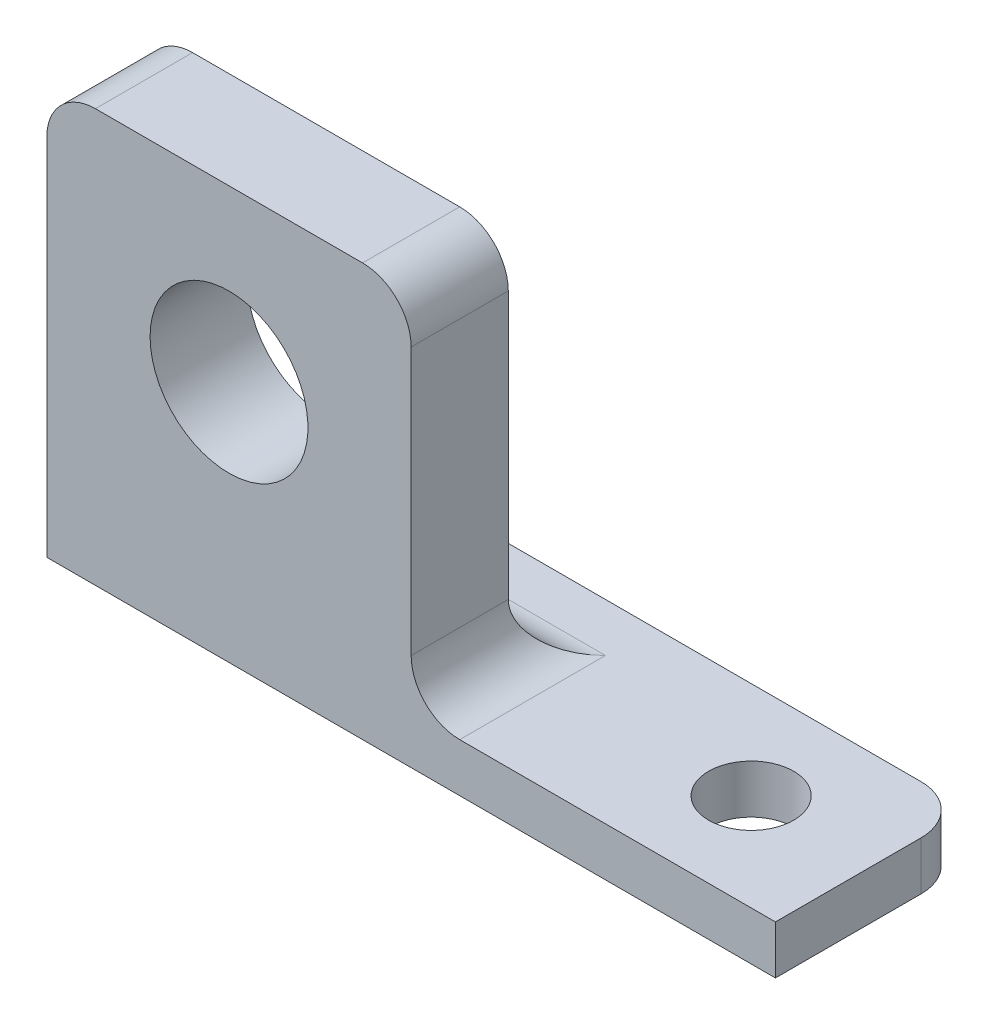
ISO-10303-21;
HEADER;
FILE_DESCRIPTION(('STEP AP214'),'2;1');
FILE_NAME('part.step','',(''),(''),'','','');
FILE_SCHEMA(('AUTOMOTIVE_DESIGN { 1 0 10303 214 1 1 1 1 }'));
ENDSEC;
DATA;
#1=APPLICATION_CONTEXT('core data for automotive mechanical design processes');
#2=APPLICATION_PROTOCOL_DEFINITION('international standard','automotive_design',2000,#1);
#3=PRODUCT_CONTEXT('',#1,'mechanical');
#4=PRODUCT('Part','Part','',(#3));
#5=PRODUCT_RELATED_PRODUCT_CATEGORY('part','',(#4));
#6=PRODUCT_DEFINITION_FORMATION('','',#4);
#7=PRODUCT_DEFINITION_CONTEXT('part definition',#1,'design');
#8=PRODUCT_DEFINITION('design','',#6,#7);
#9=PRODUCT_DEFINITION_SHAPE('','',#8);
#10=(LENGTH_UNIT() NAMED_UNIT(*) SI_UNIT(.MILLI.,.METRE.));
#11=(NAMED_UNIT(*) PLANE_ANGLE_UNIT() SI_UNIT($,.RADIAN.));
#12=(NAMED_UNIT(*) SI_UNIT($,.STERADIAN.) SOLID_ANGLE_UNIT());
#13=UNCERTAINTY_MEASURE_WITH_UNIT(LENGTH_MEASURE(1.E-05),#10,'distance_accuracy_value','');
#14=(GEOMETRIC_REPRESENTATION_CONTEXT(3) GLOBAL_UNCERTAINTY_ASSIGNED_CONTEXT((#13)) GLOBAL_UNIT_ASSIGNED_CONTEXT((#10,
#11,#12)) REPRESENTATION_CONTEXT('',''));
#15=CARTESIAN_POINT('',(0.,0.,0.));
#16=DIRECTION('',(0.,0.,1.));
#17=DIRECTION('',(1.,0.,0.));
#18=AXIS2_PLACEMENT_3D('',#15,#16,#17);
#19=CARTESIAN_POINT('',(0.,2.,0.));
#20=DIRECTION('',(0.,1.,0.));
#21=DIRECTION('',(0.,0.,1.));
#22=AXIS2_PLACEMENT_3D('',#19,#20,#21);
#23=PLANE('',#22);
#24=DIRECTION('',(0.,0.,-1.));
#25=VECTOR('',#24,1.);
#26=CARTESIAN_POINT('',(0.,2.,0.));
#27=LINE('',#26,#25);
#28=CARTESIAN_POINT('',(0.,2.,0.));
#29=VERTEX_POINT('',#28);
#30=CARTESIAN_POINT('',(0.,2.,-6.));
#31=VERTEX_POINT('',#30);
#32=EDGE_CURVE('E127',#29,#31,#27,.T.);
#33=ORIENTED_EDGE('',*,*,#32,.T.);
#34=CARTESIAN_POINT('',(-2.,2.,-6.));
#35=DIRECTION('',(0.,1.,0.));
#36=DIRECTION('',(0.,0.,1.));
#37=AXIS2_PLACEMENT_3D('',#34,#35,#36);
#38=CIRCLE('',#37,2.);
#39=CARTESIAN_POINT('',(-2.,2.,-8.));
#40=VERTEX_POINT('',#39);
#41=EDGE_CURVE('E183',#31,#40,#38,.T.);
#42=ORIENTED_EDGE('',*,*,#41,.T.);
#43=DIRECTION('',(-1.,0.,0.));
#44=VECTOR('',#43,1.);
#45=CARTESIAN_POINT('',(0.,2.,-8.));
#46=LINE('',#45,#44);
#47=CARTESIAN_POINT('',(-28.,2.,-7.99999999999999));
#48=VERTEX_POINT('',#47);
#49=EDGE_CURVE('E134',#40,#48,#46,.T.);
#50=ORIENTED_EDGE('',*,*,#49,.T.);
#51=CARTESIAN_POINT('',(-28.,2.,-5.99999999999999));
#52=DIRECTION('',(0.,1.,0.));
#53=DIRECTION('',(0.,0.,1.));
#54=AXIS2_PLACEMENT_3D('',#51,#52,#53);
#55=CIRCLE('',#54,2.);
#56=CARTESIAN_POINT('',(-30.,2.,-6.));
#57=VERTEX_POINT('',#56);
#58=EDGE_CURVE('E180',#48,#57,#55,.T.);
#59=ORIENTED_EDGE('',*,*,#58,.T.);
#60=DIRECTION('',(-1.,0.,0.));
#61=VECTOR('',#60,1.);
#62=CARTESIAN_POINT('',(0.,2.,-6.));
#63=LINE('',#62,#61);
#64=CARTESIAN_POINT('',(-13.,2.,-6.));
#65=VERTEX_POINT('',#64);
#66=EDGE_CURVE('E178',#57,#65,#63,.F.);
#67=ORIENTED_EDGE('',*,*,#66,.T.);
#68=DIRECTION('',(0.,0.,-1.));
#69=VECTOR('',#68,1.);
#70=CARTESIAN_POINT('',(-13.,2.,0.));
#71=LINE('',#70,#69);
#72=CARTESIAN_POINT('',(-13.,2.,0.));
#73=VERTEX_POINT('',#72);
#74=EDGE_CURVE('E130',#65,#73,#71,.F.);
#75=ORIENTED_EDGE('',*,*,#74,.T.);
#76=DIRECTION('',(1.,0.,0.));
#77=VECTOR('',#76,1.);
#78=CARTESIAN_POINT('',(0.,2.,0.));
#79=LINE('',#78,#77);
#80=EDGE_CURVE('E123',#73,#29,#79,.T.);
#81=ORIENTED_EDGE('',*,*,#80,.T.);
#82=EDGE_LOOP('',(#33,#42,#50,#59,#67,#75,#81));
#83=FACE_BOUND('',#82,.T.);
#84=CARTESIAN_POINT('',(-5.,2.,-4.));
#85=DIRECTION('',(0.,1.,0.));
#86=DIRECTION('',(0.,0.,1.));
#87=AXIS2_PLACEMENT_3D('',#84,#85,#86);
#88=CIRCLE('',#87,1.75);
#89=CARTESIAN_POINT('',(-5.,2.,-2.25));
#90=VERTEX_POINT('',#89);
#91=EDGE_CURVE('E161',#90,#90,#88,.T.);
#92=ORIENTED_EDGE('',*,*,#91,.F.);
#93=EDGE_LOOP('',(#92));
#94=FACE_BOUND('',#93,.T.);
#95=ADVANCED_FACE('F33',(#83,#94),#23,.T.);
#96=CARTESIAN_POINT('',(0.,0.,0.));
#97=DIRECTION('',(0.,1.,0.));
#98=DIRECTION('',(0.,0.,1.));
#99=AXIS2_PLACEMENT_3D('',#96,#97,#98);
#100=PLANE('',#99);
#101=DIRECTION('',(-1.,0.,0.));
#102=VECTOR('',#101,1.);
#103=CARTESIAN_POINT('',(0.,0.,-8.));
#104=LINE('',#103,#102);
#105=CARTESIAN_POINT('',(-2.,0.,-8.));
#106=VERTEX_POINT('',#105);
#107=CARTESIAN_POINT('',(-28.,0.,-7.99999999999999));
#108=VERTEX_POINT('',#107);
#109=EDGE_CURVE('E160',#106,#108,#104,.T.);
#110=ORIENTED_EDGE('',*,*,#109,.F.);
#111=CARTESIAN_POINT('',(-2.,0.,-6.));
#112=DIRECTION('',(0.,1.,0.));
#113=DIRECTION('',(0.,0.,1.));
#114=AXIS2_PLACEMENT_3D('',#111,#112,#113);
#115=CIRCLE('',#114,2.);
#116=CARTESIAN_POINT('',(0.,0.,-6.));
#117=VERTEX_POINT('',#116);
#118=EDGE_CURVE('E174',#106,#117,#115,.F.);
#119=ORIENTED_EDGE('',*,*,#118,.T.);
#120=DIRECTION('',(0.,0.,-1.));
#121=VECTOR('',#120,1.);
#122=CARTESIAN_POINT('',(0.,0.,0.));
#123=LINE('',#122,#121);
#124=CARTESIAN_POINT('',(0.,0.,0.));
#125=VERTEX_POINT('',#124);
#126=EDGE_CURVE('E158',#125,#117,#123,.T.);
#127=ORIENTED_EDGE('',*,*,#126,.F.);
#128=DIRECTION('',(1.,0.,0.));
#129=VECTOR('',#128,1.);
#130=CARTESIAN_POINT('',(0.,0.,0.));
#131=LINE('',#130,#129);
#132=CARTESIAN_POINT('',(-30.,0.,0.));
#133=VERTEX_POINT('',#132);
#134=EDGE_CURVE('E140',#133,#125,#131,.T.);
#135=ORIENTED_EDGE('',*,*,#134,.F.);
#136=DIRECTION('',(0.,0.,1.));
#137=VECTOR('',#136,1.);
#138=CARTESIAN_POINT('',(-30.,0.,0.));
#139=LINE('',#138,#137);
#140=CARTESIAN_POINT('',(-30.,0.,-5.99999999999999));
#141=VERTEX_POINT('',#140);
#142=EDGE_CURVE('E152',#141,#133,#139,.T.);
#143=ORIENTED_EDGE('',*,*,#142,.F.);
#144=CARTESIAN_POINT('',(-28.,0.,-5.99999999999999));
#145=DIRECTION('',(0.,1.,0.));
#146=DIRECTION('',(0.,0.,1.));
#147=AXIS2_PLACEMENT_3D('',#144,#145,#146);
#148=CIRCLE('',#147,2.);
#149=EDGE_CURVE('E172',#141,#108,#148,.F.);
#150=ORIENTED_EDGE('',*,*,#149,.T.);
#151=EDGE_LOOP('',(#110,#119,#127,#135,#143,#150));
#152=FACE_BOUND('',#151,.T.);
#153=CARTESIAN_POINT('',(-5.,0.,-4.));
#154=DIRECTION('',(0.,1.,0.));
#155=DIRECTION('',(0.,0.,1.));
#156=AXIS2_PLACEMENT_3D('',#153,#154,#155);
#157=CIRCLE('',#156,1.75);
#158=CARTESIAN_POINT('',(-5.,0.,-2.25));
#159=VERTEX_POINT('',#158);
#160=EDGE_CURVE('E155',#159,#159,#157,.T.);
#161=ORIENTED_EDGE('',*,*,#160,.T.);
#162=EDGE_LOOP('',(#161));
#163=FACE_BOUND('',#162,.T.);
#164=ADVANCED_FACE('F253',(#152,#163),#100,.F.);
#165=CARTESIAN_POINT('',(0.,2.,0.));
#166=DIRECTION('',(-1.,0.,0.));
#167=DIRECTION('',(0.,0.,1.));
#168=AXIS2_PLACEMENT_3D('',#165,#166,#167);
#169=PLANE('',#168);
#170=ORIENTED_EDGE('',*,*,#126,.T.);
#171=DIRECTION('',(0.,-1.,0.));
#172=VECTOR('',#171,1.);
#173=CARTESIAN_POINT('',(0.,2.,-6.));
#174=LINE('',#173,#172);
#175=EDGE_CURVE('E148',#117,#31,#174,.F.);
#176=ORIENTED_EDGE('',*,*,#175,.T.);
#177=ORIENTED_EDGE('',*,*,#32,.F.);
#178=DIRECTION('',(0.,-1.,0.));
#179=VECTOR('',#178,1.);
#180=CARTESIAN_POINT('',(0.,2.,0.));
#181=LINE('',#180,#179);
#182=EDGE_CURVE('E133',#29,#125,#181,.T.);
#183=ORIENTED_EDGE('',*,*,#182,.T.);
#184=EDGE_LOOP('',(#170,#176,#177,#183));
#185=FACE_BOUND('',#184,.T.);
#186=ADVANCED_FACE('F146',(#185),#169,.F.);
#187=CARTESIAN_POINT('',(0.,2.,-8.));
#188=DIRECTION('',(0.,0.,1.));
#189=DIRECTION('',(1.,0.,0.));
#190=AXIS2_PLACEMENT_3D('',#187,#188,#189);
#191=PLANE('',#190);
#192=ORIENTED_EDGE('',*,*,#49,.F.);
#193=DIRECTION('',(0.,-1.,0.));
#194=VECTOR('',#193,1.);
#195=CARTESIAN_POINT('',(-2.,2.,-8.));
#196=LINE('',#195,#194);
#197=EDGE_CURVE('E169',#40,#106,#196,.T.);
#198=ORIENTED_EDGE('',*,*,#197,.T.);
#199=ORIENTED_EDGE('',*,*,#109,.T.);
#200=DIRECTION('',(0.,-1.,0.));
#201=VECTOR('',#200,1.);
#202=CARTESIAN_POINT('',(-28.,2.,-7.99999999999999));
#203=LINE('',#202,#201);
#204=EDGE_CURVE('E167',#108,#48,#203,.F.);
#205=ORIENTED_EDGE('',*,*,#204,.T.);
#206=EDGE_LOOP('',(#192,#198,#199,#205));
#207=FACE_BOUND('',#206,.T.);
#208=ADVANCED_FACE('F277',(#207),#191,.F.);
#209=CARTESIAN_POINT('',(-30.,2.,0.));
#210=DIRECTION('',(1.,0.,0.));
#211=DIRECTION('',(0.,0.,-1.));
#212=AXIS2_PLACEMENT_3D('',#209,#210,#211);
#213=PLANE('',#212);
#214=DIRECTION('',(0.,-1.,0.));
#215=VECTOR('',#214,1.);
#216=CARTESIAN_POINT('',(-30.,17.,-4.));
#217=LINE('',#216,#215);
#218=CARTESIAN_POINT('',(-30.,15.,-4.));
#219=VERTEX_POINT('',#218);
#220=CARTESIAN_POINT('',(-30.,4.,-4.));
#221=VERTEX_POINT('',#220);
#222=EDGE_CURVE('E215',#219,#221,#217,.T.);
#223=ORIENTED_EDGE('',*,*,#222,.T.);
#224=CARTESIAN_POINT('',(-30.,4.,-6.));
#225=DIRECTION('',(1.,0.,0.));
#226=DIRECTION('',(0.,0.,-1.));
#227=AXIS2_PLACEMENT_3D('',#224,#225,#226);
#228=CIRCLE('',#227,2.);
#229=EDGE_CURVE('E42',#221,#57,#228,.T.);
#230=ORIENTED_EDGE('',*,*,#229,.T.);
#231=DIRECTION('',(0.,-1.,0.));
#232=VECTOR('',#231,1.);
#233=CARTESIAN_POINT('',(-30.,2.,-5.99999999999999));
#234=LINE('',#233,#232);
#235=EDGE_CURVE('E187',#57,#141,#234,.T.);
#236=ORIENTED_EDGE('',*,*,#235,.T.);
#237=ORIENTED_EDGE('',*,*,#142,.T.);
#238=DIRECTION('',(0.,-1.,0.));
#239=VECTOR('',#238,1.);
#240=CARTESIAN_POINT('',(-30.,2.,0.));
#241=LINE('',#240,#239);
#242=CARTESIAN_POINT('',(-30.,15.,0.));
#243=VERTEX_POINT('',#242);
#244=EDGE_CURVE('E144',#243,#133,#241,.T.);
#245=ORIENTED_EDGE('',*,*,#244,.F.);
#246=DIRECTION('',(0.,0.,1.));
#247=VECTOR('',#246,1.);
#248=CARTESIAN_POINT('',(-30.,15.,-4.));
#249=LINE('',#248,#247);
#250=EDGE_CURVE('E185',#243,#219,#249,.F.);
#251=ORIENTED_EDGE('',*,*,#250,.T.);
#252=EDGE_LOOP('',(#223,#230,#236,#237,#245,#251));
#253=FACE_BOUND('',#252,.T.);
#254=ADVANCED_FACE('F211',(#253),#213,.F.);
#255=CARTESIAN_POINT('',(0.,2.,0.));
#256=DIRECTION('',(0.,0.,-1.));
#257=DIRECTION('',(-1.,0.,0.));
#258=AXIS2_PLACEMENT_3D('',#255,#256,#257);
#259=PLANE('',#258);
#260=CARTESIAN_POINT('',(-22.5,10.,0.));
#261=DIRECTION('',(0.,0.,-1.));
#262=DIRECTION('',(-1.,0.,0.));
#263=AXIS2_PLACEMENT_3D('',#260,#261,#262);
#264=CIRCLE('',#263,3.25);
#265=CARTESIAN_POINT('',(-25.75,10.,0.));
#266=VERTEX_POINT('',#265);
#267=EDGE_CURVE('E230',#266,#266,#264,.F.);
#268=ORIENTED_EDGE('',*,*,#267,.F.);
#269=EDGE_LOOP('',(#268));
#270=FACE_BOUND('',#269,.T.);
#271=DIRECTION('',(1.,0.,0.));
#272=VECTOR('',#271,1.);
#273=CARTESIAN_POINT('',(-30.,17.,0.));
#274=LINE('',#273,#272);
#275=CARTESIAN_POINT('',(-28.,17.,0.));
#276=VERTEX_POINT('',#275);
#277=CARTESIAN_POINT('',(-17.,17.,0.));
#278=VERTEX_POINT('',#277);
#279=EDGE_CURVE('E235',#276,#278,#274,.T.);
#280=ORIENTED_EDGE('',*,*,#279,.F.);
#281=CARTESIAN_POINT('',(-28.,15.,0.));
#282=DIRECTION('',(0.,0.,-1.));
#283=DIRECTION('',(-1.,0.,0.));
#284=AXIS2_PLACEMENT_3D('',#281,#282,#283);
#285=CIRCLE('',#284,2.);
#286=EDGE_CURVE('E198',#276,#243,#285,.F.);
#287=ORIENTED_EDGE('',*,*,#286,.T.);
#288=ORIENTED_EDGE('',*,*,#244,.T.);
#289=ORIENTED_EDGE('',*,*,#134,.T.);
#290=ORIENTED_EDGE('',*,*,#182,.F.);
#291=ORIENTED_EDGE('',*,*,#80,.F.);
#292=CARTESIAN_POINT('',(-13.,4.,0.));
#293=DIRECTION('',(0.,0.,-1.));
#294=DIRECTION('',(-1.,0.,0.));
#295=AXIS2_PLACEMENT_3D('',#292,#293,#294);
#296=CIRCLE('',#295,2.);
#297=CARTESIAN_POINT('',(-15.,4.,0.));
#298=VERTEX_POINT('',#297);
#299=EDGE_CURVE('E11',#73,#298,#296,.T.);
#300=ORIENTED_EDGE('',*,*,#299,.T.);
#301=DIRECTION('',(0.,-1.,0.));
#302=VECTOR('',#301,1.);
#303=CARTESIAN_POINT('',(-15.,17.,0.));
#304=LINE('',#303,#302);
#305=CARTESIAN_POINT('',(-15.,15.,0.));
#306=VERTEX_POINT('',#305);
#307=EDGE_CURVE('E246',#306,#298,#304,.T.);
#308=ORIENTED_EDGE('',*,*,#307,.F.);
#309=CARTESIAN_POINT('',(-17.,15.,0.));
#310=DIRECTION('',(0.,0.,-1.));
#311=DIRECTION('',(-1.,0.,0.));
#312=AXIS2_PLACEMENT_3D('',#309,#310,#311);
#313=CIRCLE('',#312,2.);
#314=EDGE_CURVE('E196',#306,#278,#313,.F.);
#315=ORIENTED_EDGE('',*,*,#314,.T.);
#316=EDGE_LOOP('',(#280,#287,#288,#289,#290,#291,#300,#308,#315));
#317=FACE_BOUND('',#316,.T.);
#318=ADVANCED_FACE('F138',(#270,#317),#259,.F.);
#319=CARTESIAN_POINT('',(-5.,2.,-4.));
#320=DIRECTION('',(0.,-1.,0.));
#321=DIRECTION('',(0.,0.,-1.));
#322=AXIS2_PLACEMENT_3D('',#319,#320,#321);
#323=CYLINDRICAL_SURFACE('',#322,1.75);
#324=ORIENTED_EDGE('',*,*,#91,.T.);
#325=EDGE_LOOP('',(#324));
#326=FACE_BOUND('',#325,.T.);
#327=ORIENTED_EDGE('',*,*,#160,.F.);
#328=EDGE_LOOP('',(#327));
#329=FACE_BOUND('',#328,.T.);
#330=ADVANCED_FACE('F255',(#326,#329),#323,.F.);
#331=CARTESIAN_POINT('',(-15.,17.,-4.));
#332=DIRECTION('',(-1.,0.,0.));
#333=DIRECTION('',(0.,0.,1.));
#334=AXIS2_PLACEMENT_3D('',#331,#332,#333);
#335=PLANE('',#334);
#336=DIRECTION('',(0.,-1.,0.));
#337=VECTOR('',#336,1.);
#338=CARTESIAN_POINT('',(-15.,17.,-4.));
#339=LINE('',#338,#337);
#340=CARTESIAN_POINT('',(-15.,15.,-4.));
#341=VERTEX_POINT('',#340);
#342=CARTESIAN_POINT('',(-15.,4.,-4.));
#343=VERTEX_POINT('',#342);
#344=EDGE_CURVE('E244',#341,#343,#339,.T.);
#345=ORIENTED_EDGE('',*,*,#344,.F.);
#346=DIRECTION('',(0.,0.,-1.));
#347=VECTOR('',#346,1.);
#348=CARTESIAN_POINT('',(-15.,15.,0.));
#349=LINE('',#348,#347);
#350=EDGE_CURVE('E207',#341,#306,#349,.F.);
#351=ORIENTED_EDGE('',*,*,#350,.T.);
#352=ORIENTED_EDGE('',*,*,#307,.T.);
#353=DIRECTION('',(0.,0.,-1.));
#354=VECTOR('',#353,1.);
#355=CARTESIAN_POINT('',(-15.,4.,-4.));
#356=LINE('',#355,#354);
#357=EDGE_CURVE('E49',#298,#343,#356,.T.);
#358=ORIENTED_EDGE('',*,*,#357,.T.);
#359=EDGE_LOOP('',(#345,#351,#352,#358));
#360=FACE_BOUND('',#359,.T.);
#361=ADVANCED_FACE('F257',(#360),#335,.F.);
#362=CARTESIAN_POINT('',(-30.,17.,-4.));
#363=DIRECTION('',(0.,0.,1.));
#364=DIRECTION('',(1.,0.,0.));
#365=AXIS2_PLACEMENT_3D('',#362,#363,#364);
#366=PLANE('',#365);
#367=CARTESIAN_POINT('',(-22.5,10.,-3.99999999999999));
#368=DIRECTION('',(0.,0.,-1.));
#369=DIRECTION('',(-1.,0.,0.));
#370=AXIS2_PLACEMENT_3D('',#367,#368,#369);
#371=CIRCLE('',#370,3.25);
#372=CARTESIAN_POINT('',(-25.75,10.,-3.99999999999999));
#373=VERTEX_POINT('',#372);
#374=EDGE_CURVE('E228',#373,#373,#371,.T.);
#375=ORIENTED_EDGE('',*,*,#374,.F.);
#376=EDGE_LOOP('',(#375));
#377=FACE_BOUND('',#376,.T.);
#378=ORIENTED_EDGE('',*,*,#222,.F.);
#379=CARTESIAN_POINT('',(-28.,15.,-4.));
#380=DIRECTION('',(0.,0.,1.));
#381=DIRECTION('',(1.,0.,0.));
#382=AXIS2_PLACEMENT_3D('',#379,#380,#381);
#383=CIRCLE('',#382,2.);
#384=CARTESIAN_POINT('',(-28.,17.,-4.));
#385=VERTEX_POINT('',#384);
#386=EDGE_CURVE('E204',#219,#385,#383,.F.);
#387=ORIENTED_EDGE('',*,*,#386,.T.);
#388=DIRECTION('',(-1.,0.,0.));
#389=VECTOR('',#388,1.);
#390=CARTESIAN_POINT('',(-30.,17.,-4.));
#391=LINE('',#390,#389);
#392=CARTESIAN_POINT('',(-17.,17.,-4.));
#393=VERTEX_POINT('',#392);
#394=EDGE_CURVE('E240',#393,#385,#391,.T.);
#395=ORIENTED_EDGE('',*,*,#394,.F.);
#396=CARTESIAN_POINT('',(-17.,15.,-4.));
#397=DIRECTION('',(0.,0.,1.));
#398=DIRECTION('',(1.,0.,0.));
#399=AXIS2_PLACEMENT_3D('',#396,#397,#398);
#400=CIRCLE('',#399,2.);
#401=EDGE_CURVE('E56',#393,#341,#400,.F.);
#402=ORIENTED_EDGE('',*,*,#401,.T.);
#403=ORIENTED_EDGE('',*,*,#344,.T.);
#404=DIRECTION('',(-1.,0.,0.));
#405=VECTOR('',#404,1.);
#406=CARTESIAN_POINT('',(-30.,4.,-4.));
#407=LINE('',#406,#405);
#408=EDGE_CURVE('E200',#343,#221,#407,.T.);
#409=ORIENTED_EDGE('',*,*,#408,.T.);
#410=EDGE_LOOP('',(#378,#387,#395,#402,#403,#409));
#411=FACE_BOUND('',#410,.T.);
#412=ADVANCED_FACE('F263',(#377,#411),#366,.F.);
#413=CARTESIAN_POINT('',(0.,17.,0.));
#414=DIRECTION('',(0.,1.,0.));
#415=DIRECTION('',(0.,0.,1.));
#416=AXIS2_PLACEMENT_3D('',#413,#414,#415);
#417=PLANE('',#416);
#418=ORIENTED_EDGE('',*,*,#394,.T.);
#419=DIRECTION('',(0.,0.,1.));
#420=VECTOR('',#419,1.);
#421=CARTESIAN_POINT('',(-28.,17.,0.));
#422=LINE('',#421,#420);
#423=EDGE_CURVE('E193',#385,#276,#422,.T.);
#424=ORIENTED_EDGE('',*,*,#423,.T.);
#425=ORIENTED_EDGE('',*,*,#279,.T.);
#426=DIRECTION('',(0.,0.,-1.));
#427=VECTOR('',#426,1.);
#428=CARTESIAN_POINT('',(-17.,17.,-4.));
#429=LINE('',#428,#427);
#430=EDGE_CURVE('E190',#278,#393,#429,.T.);
#431=ORIENTED_EDGE('',*,*,#430,.T.);
#432=EDGE_LOOP('',(#418,#424,#425,#431));
#433=FACE_BOUND('',#432,.T.);
#434=ADVANCED_FACE('F308',(#433),#417,.T.);
#435=CARTESIAN_POINT('',(-22.5,10.,9.19238815542512));
#436=DIRECTION('',(0.,0.,-1.));
#437=DIRECTION('',(-1.,0.,0.));
#438=AXIS2_PLACEMENT_3D('',#435,#436,#437);
#439=CYLINDRICAL_SURFACE('',#438,3.25);
#440=ORIENTED_EDGE('',*,*,#267,.T.);
#441=EDGE_LOOP('',(#440));
#442=FACE_BOUND('',#441,.T.);
#443=ORIENTED_EDGE('',*,*,#374,.T.);
#444=EDGE_LOOP('',(#443));
#445=FACE_BOUND('',#444,.T.);
#446=ADVANCED_FACE('F286',(#442,#445),#439,.F.);
#447=CARTESIAN_POINT('',(-2.,2.,-6.));
#448=DIRECTION('',(0.,-1.,0.));
#449=DIRECTION('',(0.,0.,-1.));
#450=AXIS2_PLACEMENT_3D('',#447,#448,#449);
#451=CYLINDRICAL_SURFACE('',#450,2.);
#452=ORIENTED_EDGE('',*,*,#41,.F.);
#453=ORIENTED_EDGE('',*,*,#175,.F.);
#454=ORIENTED_EDGE('',*,*,#118,.F.);
#455=ORIENTED_EDGE('',*,*,#197,.F.);
#456=EDGE_LOOP('',(#452,#453,#454,#455));
#457=FACE_BOUND('',#456,.T.);
#458=ADVANCED_FACE('F283',(#457),#451,.T.);
#459=CARTESIAN_POINT('',(-28.,2.,-5.99999999999999));
#460=DIRECTION('',(0.,-1.,0.));
#461=DIRECTION('',(0.,0.,-1.));
#462=AXIS2_PLACEMENT_3D('',#459,#460,#461);
#463=CYLINDRICAL_SURFACE('',#462,2.);
#464=ORIENTED_EDGE('',*,*,#58,.F.);
#465=ORIENTED_EDGE('',*,*,#204,.F.);
#466=ORIENTED_EDGE('',*,*,#149,.F.);
#467=ORIENTED_EDGE('',*,*,#235,.F.);
#468=EDGE_LOOP('',(#464,#465,#466,#467));
#469=FACE_BOUND('',#468,.T.);
#470=ADVANCED_FACE('F223',(#469),#463,.T.);
#471=CARTESIAN_POINT('',(-28.,15.,0.));
#472=DIRECTION('',(0.,0.,-1.));
#473=DIRECTION('',(-1.,0.,0.));
#474=AXIS2_PLACEMENT_3D('',#471,#472,#473);
#475=CYLINDRICAL_SURFACE('',#474,2.);
#476=ORIENTED_EDGE('',*,*,#386,.F.);
#477=ORIENTED_EDGE('',*,*,#250,.F.);
#478=ORIENTED_EDGE('',*,*,#286,.F.);
#479=ORIENTED_EDGE('',*,*,#423,.F.);
#480=EDGE_LOOP('',(#476,#477,#478,#479));
#481=FACE_BOUND('',#480,.T.);
#482=ADVANCED_FACE('F290',(#481),#475,.T.);
#483=CARTESIAN_POINT('',(-17.,15.,0.));
#484=DIRECTION('',(0.,0.,1.));
#485=DIRECTION('',(1.,0.,0.));
#486=AXIS2_PLACEMENT_3D('',#483,#484,#485);
#487=CYLINDRICAL_SURFACE('',#486,2.);
#488=ORIENTED_EDGE('',*,*,#314,.F.);
#489=ORIENTED_EDGE('',*,*,#350,.F.);
#490=ORIENTED_EDGE('',*,*,#401,.F.);
#491=ORIENTED_EDGE('',*,*,#430,.F.);
#492=EDGE_LOOP('',(#488,#489,#490,#491));
#493=FACE_BOUND('',#492,.T.);
#494=ADVANCED_FACE('F293',(#493),#487,.T.);
#495=CARTESIAN_POINT('',(-13.,4.,-4.));
#496=DIRECTION('',(0.,0.,-1.));
#497=DIRECTION('',(-1.,0.,0.));
#498=AXIS2_PLACEMENT_3D('',#495,#496,#497);
#499=CYLINDRICAL_SURFACE('',#498,2.);
#500=ORIENTED_EDGE('',*,*,#299,.F.);
#501=ORIENTED_EDGE('',*,*,#74,.F.);
#502=CARTESIAN_POINT('',(-13.,4.,-6.));
#503=DIRECTION('',(-0.707106781186548,0.,-0.707106781186547));
#504=DIRECTION('',(0.707106781186547,0.,-0.707106781186548));
#505=AXIS2_PLACEMENT_3D('',#502,#503,#504);
#506=ELLIPSE('',#505,2.82842712474619,2.);
#507=EDGE_CURVE('E37',#343,#65,#506,.F.);
#508=ORIENTED_EDGE('',*,*,#507,.F.);
#509=ORIENTED_EDGE('',*,*,#357,.F.);
#510=EDGE_LOOP('',(#500,#501,#508,#509));
#511=FACE_BOUND('',#510,.T.);
#512=ADVANCED_FACE('F35',(#511),#499,.F.);
#513=CARTESIAN_POINT('',(-30.,4.,-6.));
#514=DIRECTION('',(-1.,0.,0.));
#515=DIRECTION('',(0.,0.,1.));
#516=AXIS2_PLACEMENT_3D('',#513,#514,#515);
#517=CYLINDRICAL_SURFACE('',#516,2.);
#518=ORIENTED_EDGE('',*,*,#507,.T.);
#519=ORIENTED_EDGE('',*,*,#66,.F.);
#520=ORIENTED_EDGE('',*,*,#229,.F.);
#521=ORIENTED_EDGE('',*,*,#408,.F.);
#522=EDGE_LOOP('',(#518,#519,#520,#521));
#523=FACE_BOUND('',#522,.T.);
#524=ADVANCED_FACE('F225',(#523),#517,.F.);
#525=CLOSED_SHELL('',(#95,#164,#186,#208,#254,#318,#330,#361,#412,#434,#446,#458,#470,#482,#494,
#512,#524));
#526=MANIFOLD_SOLID_BREP('B2',#525);
#527=ADVANCED_BREP_SHAPE_REPRESENTATION('',(#18,#526),#14);
#528=SHAPE_DEFINITION_REPRESENTATION(#9,#527);
ENDSEC;
END-ISO-10303-21;
